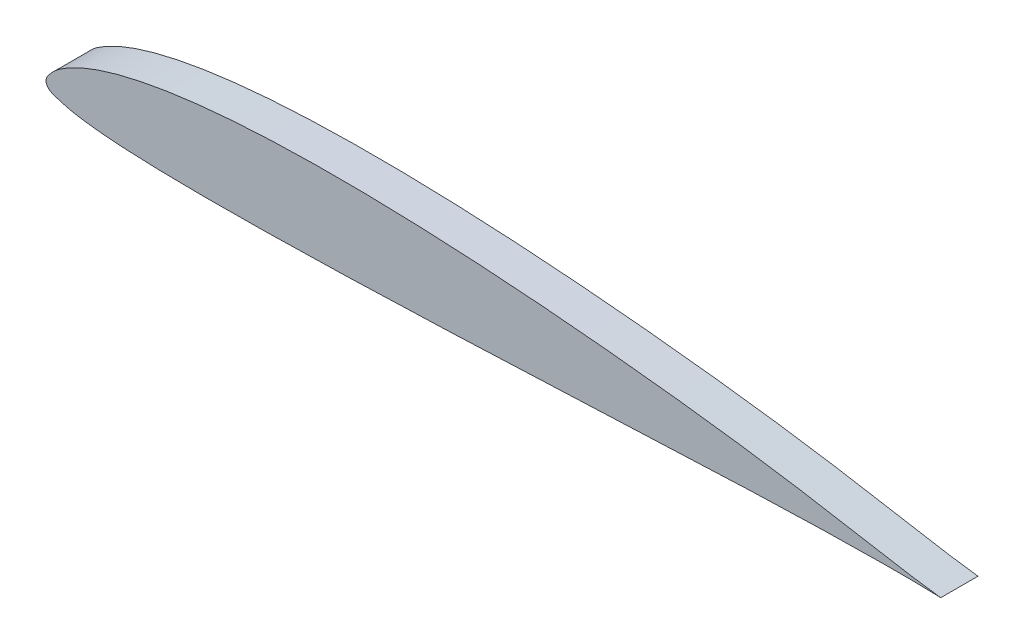
ISO-10303-21;
HEADER;
FILE_DESCRIPTION(('STEP AP214'),'2;1');
FILE_NAME('part.step','',(''),(''),'','','');
FILE_SCHEMA(('AUTOMOTIVE_DESIGN { 1 0 10303 214 1 1 1 1 }'));
ENDSEC;
DATA;
#1=APPLICATION_CONTEXT('core data for automotive mechanical design processes');
#2=APPLICATION_PROTOCOL_DEFINITION('international standard','automotive_design',2000,#1);
#3=PRODUCT_CONTEXT('',#1,'mechanical');
#4=PRODUCT('Part','Part','',(#3));
#5=PRODUCT_RELATED_PRODUCT_CATEGORY('part','',(#4));
#6=PRODUCT_DEFINITION_FORMATION('','',#4);
#7=PRODUCT_DEFINITION_CONTEXT('part definition',#1,'design');
#8=PRODUCT_DEFINITION('design','',#6,#7);
#9=PRODUCT_DEFINITION_SHAPE('','',#8);
#10=(LENGTH_UNIT() NAMED_UNIT(*) SI_UNIT(.MILLI.,.METRE.));
#11=(NAMED_UNIT(*) PLANE_ANGLE_UNIT() SI_UNIT($,.RADIAN.));
#12=(NAMED_UNIT(*) SI_UNIT($,.STERADIAN.) SOLID_ANGLE_UNIT());
#13=UNCERTAINTY_MEASURE_WITH_UNIT(LENGTH_MEASURE(1.E-05),#10,'distance_accuracy_value','');
#14=(GEOMETRIC_REPRESENTATION_CONTEXT(3) GLOBAL_UNCERTAINTY_ASSIGNED_CONTEXT((#13)) GLOBAL_UNIT_ASSIGNED_CONTEXT((#10,
#11,#12)) REPRESENTATION_CONTEXT('',''));
#15=CARTESIAN_POINT('',(0.,0.,0.));
#16=DIRECTION('',(0.,0.,1.));
#17=DIRECTION('',(1.,0.,0.));
#18=AXIS2_PLACEMENT_3D('',#15,#16,#17);
#19=CARTESIAN_POINT('',(0.316135931997105,6.9339147751367,6.35));
#20=DIRECTION('',(0.0455453922574668,0.998962270180468,0.));
#21=DIRECTION('',(-0.998962270180468,0.0455453922574668,0.));
#22=AXIS2_PLACEMENT_3D('',#19,#20,#21);
#23=PLANE('',#22);
#24=DIRECTION('',(0.998962270180468,-0.0455453922574668,0.));
#25=VECTOR('',#24,1.);
#26=CARTESIAN_POINT('',(0.316135931997105,6.9339147751367,0.));
#27=LINE('',#26,#25);
#28=CARTESIAN_POINT('',(151.898604,0.0228599999999995,0.));
#29=VERTEX_POINT('',#28);
#30=CARTESIAN_POINT('',(152.4,0.,0.));
#31=VERTEX_POINT('',#30);
#32=EDGE_CURVE('E82',#29,#31,#27,.T.);
#33=ORIENTED_EDGE('',*,*,#32,.T.);
#34=DIRECTION('',(0.,0.,-1.));
#35=VECTOR('',#34,1.);
#36=CARTESIAN_POINT('',(152.4,0.,6.35));
#37=LINE('',#36,#35);
#38=CARTESIAN_POINT('',(152.4,0.,6.35));
#39=VERTEX_POINT('',#38);
#40=EDGE_CURVE('E11',#39,#31,#37,.T.);
#41=ORIENTED_EDGE('',*,*,#40,.F.);
#42=DIRECTION('',(0.998962270180468,-0.0455453922574668,0.));
#43=VECTOR('',#42,1.);
#44=CARTESIAN_POINT('',(0.316135931997105,6.9339147751367,6.35));
#45=LINE('',#44,#43);
#46=CARTESIAN_POINT('',(151.898604,0.0228599999999995,6.35));
#47=VERTEX_POINT('',#46);
#48=EDGE_CURVE('E81',#47,#39,#45,.T.);
#49=ORIENTED_EDGE('',*,*,#48,.F.);
#50=DIRECTION('',(0.,0.,-1.));
#51=VECTOR('',#50,1.);
#52=CARTESIAN_POINT('',(151.898604,0.0228599999999995,6.35));
#53=LINE('',#52,#51);
#54=EDGE_CURVE('E58',#47,#29,#53,.T.);
#55=ORIENTED_EDGE('',*,*,#54,.T.);
#56=EDGE_LOOP('',(#33,#41,#49,#55));
#57=FACE_BOUND('',#56,.T.);
#58=ADVANCED_FACE('F49',(#57),#23,.F.);
#59=CARTESIAN_POINT('',(152.4,0.,6.35));
#60=CARTESIAN_POINT('',(152.232833718495,0.0185024145844094,6.35));
#61=CARTESIAN_POINT('',(151.571843934071,0.0916625454276125,6.35));
#62=CARTESIAN_POINT('',(150.11399955714,0.283859600165364,6.35));
#63=CARTESIAN_POINT('',(147.749385864208,0.638650628689324,6.35));
#64=CARTESIAN_POINT('',(144.555943785527,1.17015700229937,6.35));
#65=CARTESIAN_POINT('',(140.615360499081,1.85909924705757,6.35));
#66=CARTESIAN_POINT('',(136.007834995224,2.67146012975516,6.35));
#67=CARTESIAN_POINT('',(130.806388018581,3.56284001663103,6.35));
#68=CARTESIAN_POINT('',(125.073826155466,4.48615477740971,6.35));
#69=CARTESIAN_POINT('',(118.8646901353,5.39775327756707,6.35));
#70=CARTESIAN_POINT('',(112.233312125261,6.27297423591478,6.35));
#71=CARTESIAN_POINT('',(105.243489487442,7.10605889156724,6.35));
#72=CARTESIAN_POINT('',(97.9696654062804,7.88931969327321,6.35));
#73=CARTESIAN_POINT('',(90.4927249927246,8.60673485806436,6.35));
#74=CARTESIAN_POINT('',(82.8952532405217,9.2406702507931,6.35));
#75=CARTESIAN_POINT('',(75.2586679023908,9.77749908015344,6.35));
#76=CARTESIAN_POINT('',(67.6629284232157,10.1988157178373,6.35));
#77=CARTESIAN_POINT('',(60.1868274986299,10.4917010195868,6.35));
#78=CARTESIAN_POINT('',(52.9059459542408,10.6450800985298,6.35));
#79=CARTESIAN_POINT('',(45.8917437129946,10.6445518064523,6.35));
#80=CARTESIAN_POINT('',(39.2106810479072,10.4862475970987,6.35));
#81=CARTESIAN_POINT('',(32.923263797137,10.1644127111138,6.35));
#82=CARTESIAN_POINT('',(27.0837008540271,9.67093972647032,6.35));
#83=CARTESIAN_POINT('',(21.737197539699,9.01650809069112,6.35));
#84=CARTESIAN_POINT('',(16.9243447592619,8.20408197388868,6.35));
#85=CARTESIAN_POINT('',(12.6762753048712,7.24977047946681,6.35));
#86=CARTESIAN_POINT('',(9.01981569255257,6.17445777095632,6.35));
#87=CARTESIAN_POINT('',(5.96569481917708,5.00201852215155,6.35));
#88=CARTESIAN_POINT('',(3.54403253695888,3.76987152616717,6.35));
#89=CARTESIAN_POINT('',(1.70483470840094,2.53149972603197,6.35));
#90=CARTESIAN_POINT('',(0.575239505776366,1.34473752883143,6.35));
#91=CARTESIAN_POINT('',(-0.170728015466049,0.203106959768801,6.35));
#92=CARTESIAN_POINT('',(0.337603285303623,-1.00177222805816,6.35));
#93=CARTESIAN_POINT('',(1.79294322608063,-1.54672679451716,6.35));
#94=CARTESIAN_POINT('',(3.794232234597,-2.17716445974196,6.35));
#95=CARTESIAN_POINT('',(6.64340020089969,-2.64392231576436,6.35));
#96=CARTESIAN_POINT('',(10.2161106536038,-3.04195363150428,6.35));
#97=CARTESIAN_POINT('',(14.5300841872538,-3.31987222771604,6.35));
#98=CARTESIAN_POINT('',(19.5339696288078,-3.49767725483492,6.35));
#99=CARTESIAN_POINT('',(25.1869220599411,-3.57763834503169,6.35));
#100=CARTESIAN_POINT('',(31.42862727455,-3.57384808178261,6.35));
#101=CARTESIAN_POINT('',(38.191948203283,-3.49658144160037,6.35));
#102=CARTESIAN_POINT('',(45.4015953170636,-3.34930898576548,6.35));
#103=CARTESIAN_POINT('',(52.9784172595709,-3.14184128811128,6.35));
#104=CARTESIAN_POINT('',(60.8386741403337,-2.88526226056694,6.35));
#105=CARTESIAN_POINT('',(68.8949884243473,-2.58793090460575,6.35));
#106=CARTESIAN_POINT('',(77.057432025165,-2.25888288701279,6.35));
#107=CARTESIAN_POINT('',(85.2350096722083,-1.90773028344113,6.35));
#108=CARTESIAN_POINT('',(93.3354268335371,-1.55016881909302,6.35));
#109=CARTESIAN_POINT('',(101.266049648543,-1.19546522084977,6.35));
#110=CARTESIAN_POINT('',(108.934170809505,-0.862411005508114,6.35));
#111=CARTESIAN_POINT('',(116.246498600348,-0.557504044589403,6.35));
#112=CARTESIAN_POINT('',(123.110150898588,-0.3069361826572,6.35));
#113=CARTESIAN_POINT('',(129.431690532645,-0.107922528146747,6.35));
#114=CARTESIAN_POINT('',(135.123521438346,0.0279744509983298,6.35));
#115=CARTESIAN_POINT('',(140.103603919286,0.108900524885163,6.35));
#116=CARTESIAN_POINT('',(144.299415419815,0.139938590331548,6.35));
#117=CARTESIAN_POINT('',(147.644768246445,0.124243060792821,6.35));
#118=CARTESIAN_POINT('',(150.083437285214,0.0865028877410205,6.35));
#119=CARTESIAN_POINT('',(151.399782071317,0.0403495604636981,6.35));
#120=CARTESIAN_POINT('',(151.898604,0.02286,6.35));
#121=B_SPLINE_CURVE_WITH_KNOTS('',3,(#59,#60,#61,#62,#63,#64,#65,#66,#67,#68,#69,#70,#71,#72,
#73,#74,#75,#76,#77,#78,#79,#80,#81,#82,#83,#84,#85,#86,#87,#88,#89,#90,#91,#92,#93,#94,#95,#96,
#97,#98,#99,#100,#101,#102,#103,#104,#105,#106,#107,#108,#109,#110,#111,#112,#113,#114,#115,
#116,#117,#118,#119,#120),.UNSPECIFIED.,.F.,.F.,(4,1,1,1,1,1,1,1,1,1,1,1,1,1,1,1,1,1,1,1,1,1,1,
1,1,1,1,1,1,1,1,1,1,1,1,1,1,1,1,1,1,1,1,1,1,1,1,1,1,1,1,1,1,1,1,1,1,1,1,4),(0.,
0.00163535583425865,0.00646633693476808,0.0142965918772176,0.0248842088552096,
0.0379439925510076,0.0531941368467982,0.0703765688743697,0.0892572179770476,0.109651763058439,
0.131396199224683,0.154294670265703,0.178096902835303,0.202530723472683,0.227328973387424,
0.25222580652472,0.276966075496197,0.301296827478668,0.324972088966137,0.347773045551505,
0.369493848961825,0.389946984550237,0.40897941596321,0.426465789850067,0.442306728816157,
0.456421239565711,0.46877353813753,0.47934514980936,0.488155641306995,0.495223141471028,
0.500608247512498,0.504417035913407,0.507344225330662,0.511892730711683,0.518766332626908,
0.528062399813873,0.5397504852938,0.553781923901918,0.570059197087642,0.588441486429501,
0.608747967256935,0.630750043644814,0.654207709776473,0.678865071069041,0.704450570233279,
0.73067750330715,0.757253936726054,0.783882586633168,0.810265561255861,0.836095192051152,
0.861073222293053,0.884896986100605,0.907258357413886,0.927856250220039,0.946394646161361,
0.962618153964165,0.976286171395788,0.987192827864271,0.995146789524168,1.),.UNSPECIFIED.);
#122=DIRECTION('',(0.,0.,-1.));
#123=VECTOR('',#122,1.);
#124=SURFACE_OF_LINEAR_EXTRUSION('',#121,#123);
#125=CARTESIAN_POINT('',(152.4,0.,0.));
#126=CARTESIAN_POINT('',(152.232833718495,0.0185024145844094,0.));
#127=CARTESIAN_POINT('',(151.571843934071,0.0916625454276125,0.));
#128=CARTESIAN_POINT('',(150.11399955714,0.283859600165364,0.));
#129=CARTESIAN_POINT('',(147.749385864208,0.638650628689324,0.));
#130=CARTESIAN_POINT('',(144.555943785527,1.17015700229937,0.));
#131=CARTESIAN_POINT('',(140.615360499081,1.85909924705757,0.));
#132=CARTESIAN_POINT('',(136.007834995224,2.67146012975516,0.));
#133=CARTESIAN_POINT('',(130.806388018581,3.56284001663103,0.));
#134=CARTESIAN_POINT('',(125.073826155466,4.48615477740971,0.));
#135=CARTESIAN_POINT('',(118.8646901353,5.39775327756707,0.));
#136=CARTESIAN_POINT('',(112.233312125261,6.27297423591478,0.));
#137=CARTESIAN_POINT('',(105.243489487442,7.10605889156724,0.));
#138=CARTESIAN_POINT('',(97.9696654062804,7.88931969327321,0.));
#139=CARTESIAN_POINT('',(90.4927249927246,8.60673485806436,0.));
#140=CARTESIAN_POINT('',(82.8952532405217,9.2406702507931,0.));
#141=CARTESIAN_POINT('',(75.2586679023908,9.77749908015344,0.));
#142=CARTESIAN_POINT('',(67.6629284232157,10.1988157178373,0.));
#143=CARTESIAN_POINT('',(60.1868274986299,10.4917010195868,0.));
#144=CARTESIAN_POINT('',(52.9059459542408,10.6450800985298,0.));
#145=CARTESIAN_POINT('',(45.8917437129946,10.6445518064523,0.));
#146=CARTESIAN_POINT('',(39.2106810479072,10.4862475970987,0.));
#147=CARTESIAN_POINT('',(32.923263797137,10.1644127111138,0.));
#148=CARTESIAN_POINT('',(27.0837008540271,9.67093972647032,0.));
#149=CARTESIAN_POINT('',(21.737197539699,9.01650809069112,0.));
#150=CARTESIAN_POINT('',(16.9243447592619,8.20408197388868,0.));
#151=CARTESIAN_POINT('',(12.6762753048712,7.24977047946681,0.));
#152=CARTESIAN_POINT('',(9.01981569255257,6.17445777095632,0.));
#153=CARTESIAN_POINT('',(5.96569481917708,5.00201852215155,0.));
#154=CARTESIAN_POINT('',(3.54403253695888,3.76987152616717,0.));
#155=CARTESIAN_POINT('',(1.70483470840094,2.53149972603197,0.));
#156=CARTESIAN_POINT('',(0.575239505776366,1.34473752883143,0.));
#157=CARTESIAN_POINT('',(-0.170728015466049,0.203106959768801,0.));
#158=CARTESIAN_POINT('',(0.337603285303623,-1.00177222805816,0.));
#159=CARTESIAN_POINT('',(1.79294322608063,-1.54672679451716,0.));
#160=CARTESIAN_POINT('',(3.794232234597,-2.17716445974196,0.));
#161=CARTESIAN_POINT('',(6.64340020089969,-2.64392231576436,0.));
#162=CARTESIAN_POINT('',(10.2161106536038,-3.04195363150428,0.));
#163=CARTESIAN_POINT('',(14.5300841872538,-3.31987222771604,0.));
#164=CARTESIAN_POINT('',(19.5339696288078,-3.49767725483492,0.));
#165=CARTESIAN_POINT('',(25.1869220599411,-3.57763834503169,0.));
#166=CARTESIAN_POINT('',(31.42862727455,-3.57384808178261,0.));
#167=CARTESIAN_POINT('',(38.191948203283,-3.49658144160037,0.));
#168=CARTESIAN_POINT('',(45.4015953170636,-3.34930898576548,0.));
#169=CARTESIAN_POINT('',(52.9784172595709,-3.14184128811128,0.));
#170=CARTESIAN_POINT('',(60.8386741403337,-2.88526226056694,0.));
#171=CARTESIAN_POINT('',(68.8949884243473,-2.58793090460575,0.));
#172=CARTESIAN_POINT('',(77.057432025165,-2.25888288701279,0.));
#173=CARTESIAN_POINT('',(85.2350096722083,-1.90773028344113,0.));
#174=CARTESIAN_POINT('',(93.3354268335371,-1.55016881909302,0.));
#175=CARTESIAN_POINT('',(101.266049648543,-1.19546522084977,0.));
#176=CARTESIAN_POINT('',(108.934170809505,-0.862411005508114,0.));
#177=CARTESIAN_POINT('',(116.246498600348,-0.557504044589403,0.));
#178=CARTESIAN_POINT('',(123.110150898588,-0.3069361826572,0.));
#179=CARTESIAN_POINT('',(129.431690532645,-0.107922528146747,0.));
#180=CARTESIAN_POINT('',(135.123521438346,0.0279744509983298,0.));
#181=CARTESIAN_POINT('',(140.103603919286,0.108900524885163,0.));
#182=CARTESIAN_POINT('',(144.299415419815,0.139938590331548,0.));
#183=CARTESIAN_POINT('',(147.644768246445,0.124243060792821,0.));
#184=CARTESIAN_POINT('',(150.083437285214,0.0865028877410205,0.));
#185=CARTESIAN_POINT('',(151.399782071317,0.0403495604636981,0.));
#186=CARTESIAN_POINT('',(151.898604,0.02286,0.));
#187=B_SPLINE_CURVE_WITH_KNOTS('',3,(#125,#126,#127,#128,#129,#130,#131,#132,#133,#134,#135,
#136,#137,#138,#139,#140,#141,#142,#143,#144,#145,#146,#147,#148,#149,#150,#151,#152,#153,#154,
#155,#156,#157,#158,#159,#160,#161,#162,#163,#164,#165,#166,#167,#168,#169,#170,#171,#172,#173,
#174,#175,#176,#177,#178,#179,#180,#181,#182,#183,#184,#185,#186),.UNSPECIFIED.,.F.,.F.,(4,1,1,
1,1,1,1,1,1,1,1,1,1,1,1,1,1,1,1,1,1,1,1,1,1,1,1,1,1,1,1,1,1,1,1,1,1,1,1,1,1,1,1,1,1,1,1,1,1,1,1,
1,1,1,1,1,1,1,1,4),(0.,0.00163535583425865,0.00646633693476808,0.0142965918772176,
0.0248842088552096,0.0379439925510076,0.0531941368467982,0.0703765688743697,0.0892572179770476,
0.109651763058439,0.131396199224683,0.154294670265703,0.178096902835303,0.202530723472683,
0.227328973387424,0.25222580652472,0.276966075496197,0.301296827478668,0.324972088966137,
0.347773045551505,0.369493848961825,0.389946984550237,0.40897941596321,0.426465789850067,
0.442306728816157,0.456421239565711,0.46877353813753,0.47934514980936,0.488155641306995,
0.495223141471028,0.500608247512498,0.504417035913407,0.507344225330662,0.511892730711683,
0.518766332626908,0.528062399813873,0.5397504852938,0.553781923901918,0.570059197087642,
0.588441486429501,0.608747967256935,0.630750043644814,0.654207709776473,0.678865071069041,
0.704450570233279,0.73067750330715,0.757253936726054,0.783882586633168,0.810265561255861,
0.836095192051152,0.861073222293053,0.884896986100605,0.907258357413886,0.927856250220039,
0.946394646161361,0.962618153964165,0.976286171395788,0.987192827864271,0.995146789524168,1.),.UNSPECIFIED.);
#188=EDGE_CURVE('E73',#31,#29,#187,.T.);
#189=ORIENTED_EDGE('',*,*,#188,.T.);
#190=ORIENTED_EDGE('',*,*,#54,.F.);
#191=EDGE_CURVE('E65',#39,#47,#121,.T.);
#192=ORIENTED_EDGE('',*,*,#191,.F.);
#193=ORIENTED_EDGE('',*,*,#40,.T.);
#194=EDGE_LOOP('',(#189,#190,#192,#193));
#195=FACE_BOUND('',#194,.T.);
#196=ADVANCED_FACE('F76',(#195),#124,.F.);
#197=CARTESIAN_POINT('',(0.,0.,6.35));
#198=DIRECTION('',(0.,0.,1.));
#199=DIRECTION('',(1.,0.,0.));
#200=AXIS2_PLACEMENT_3D('',#197,#198,#199);
#201=PLANE('',#200);
#202=ORIENTED_EDGE('',*,*,#48,.T.);
#203=ORIENTED_EDGE('',*,*,#191,.T.);
#204=EDGE_LOOP('',(#202,#203));
#205=FACE_BOUND('',#204,.T.);
#206=ADVANCED_FACE('F105',(#205),#201,.T.);
#207=CARTESIAN_POINT('',(0.,0.,0.));
#208=DIRECTION('',(0.,0.,1.));
#209=DIRECTION('',(1.,0.,0.));
#210=AXIS2_PLACEMENT_3D('',#207,#208,#209);
#211=PLANE('',#210);
#212=ORIENTED_EDGE('',*,*,#32,.F.);
#213=ORIENTED_EDGE('',*,*,#188,.F.);
#214=EDGE_LOOP('',(#212,#213));
#215=FACE_BOUND('',#214,.T.);
#216=ADVANCED_FACE('F86',(#215),#211,.F.);
#217=CLOSED_SHELL('',(#58,#196,#206,#216));
#218=MANIFOLD_SOLID_BREP('B2',#217);
#219=ADVANCED_BREP_SHAPE_REPRESENTATION('',(#18,#218),#14);
#220=SHAPE_DEFINITION_REPRESENTATION(#9,#219);
ENDSEC;
END-ISO-10303-21;
